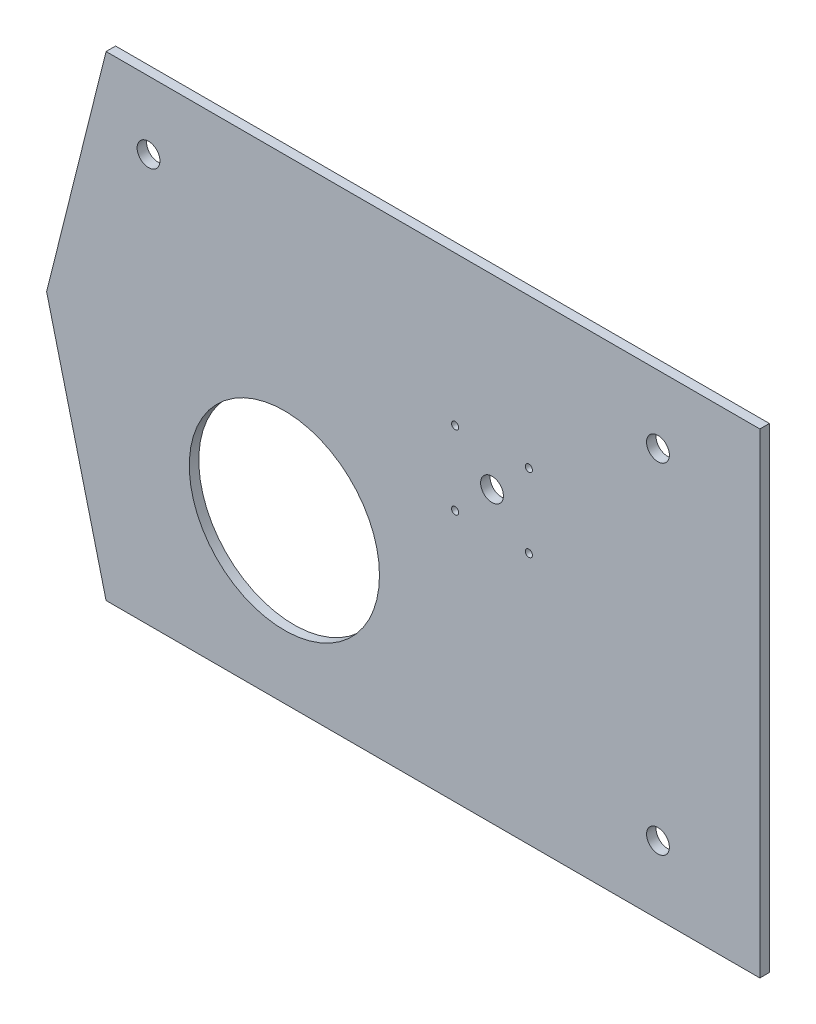
ISO-10303-21;
HEADER;
FILE_DESCRIPTION(('STEP AP214'),'2;1');
FILE_NAME('part.step','',(''),(''),'','','');
FILE_SCHEMA(('AUTOMOTIVE_DESIGN { 1 0 10303 214 1 1 1 1 }'));
ENDSEC;
DATA;
#1=APPLICATION_CONTEXT('core data for automotive mechanical design processes');
#2=APPLICATION_PROTOCOL_DEFINITION('international standard','automotive_design',2000,#1);
#3=PRODUCT_CONTEXT('',#1,'mechanical');
#4=PRODUCT('Part','Part','',(#3));
#5=PRODUCT_RELATED_PRODUCT_CATEGORY('part','',(#4));
#6=PRODUCT_DEFINITION_FORMATION('','',#4);
#7=PRODUCT_DEFINITION_CONTEXT('part definition',#1,'design');
#8=PRODUCT_DEFINITION('design','',#6,#7);
#9=PRODUCT_DEFINITION_SHAPE('','',#8);
#10=(LENGTH_UNIT() NAMED_UNIT(*) SI_UNIT(.MILLI.,.METRE.));
#11=(NAMED_UNIT(*) PLANE_ANGLE_UNIT() SI_UNIT($,.RADIAN.));
#12=(NAMED_UNIT(*) SI_UNIT($,.STERADIAN.) SOLID_ANGLE_UNIT());
#13=UNCERTAINTY_MEASURE_WITH_UNIT(LENGTH_MEASURE(1.E-05),#10,'distance_accuracy_value','');
#14=(GEOMETRIC_REPRESENTATION_CONTEXT(3) GLOBAL_UNCERTAINTY_ASSIGNED_CONTEXT((#13)) GLOBAL_UNIT_ASSIGNED_CONTEXT((#10,
#11,#12)) REPRESENTATION_CONTEXT('',''));
#15=CARTESIAN_POINT('',(0.,0.,0.));
#16=DIRECTION('',(0.,0.,1.));
#17=DIRECTION('',(1.,0.,0.));
#18=AXIS2_PLACEMENT_3D('',#15,#16,#17);
#19=CARTESIAN_POINT('',(-141.176470588235,35.2941176470588,4.));
#20=DIRECTION('',(-0.970142500145332,0.242535625036333,0.));
#21=DIRECTION('',(-0.242535625036333,-0.970142500145332,0.));
#22=AXIS2_PLACEMENT_3D('',#19,#20,#21);
#23=PLANE('',#22);
#24=DIRECTION('',(0.242535625036333,0.970142500145332,0.));
#25=VECTOR('',#24,1.);
#26=CARTESIAN_POINT('',(-141.176470588235,35.2941176470588,0.));
#27=LINE('',#26,#25);
#28=CARTESIAN_POINT('',(-150.,0.,0.));
#29=VERTEX_POINT('',#28);
#30=CARTESIAN_POINT('',(-125.,99.9999999999999,0.));
#31=VERTEX_POINT('',#30);
#32=EDGE_CURVE('E142',#29,#31,#27,.T.);
#33=ORIENTED_EDGE('',*,*,#32,.F.);
#34=DIRECTION('',(0.,0.,-1.));
#35=VECTOR('',#34,1.);
#36=CARTESIAN_POINT('',(-150.,0.,4.));
#37=LINE('',#36,#35);
#38=CARTESIAN_POINT('',(-150.,0.,4.));
#39=VERTEX_POINT('',#38);
#40=EDGE_CURVE('E11',#39,#29,#37,.T.);
#41=ORIENTED_EDGE('',*,*,#40,.F.);
#42=DIRECTION('',(0.242535625036333,0.970142500145332,0.));
#43=VECTOR('',#42,1.);
#44=CARTESIAN_POINT('',(-141.176470588235,35.2941176470588,4.));
#45=LINE('',#44,#43);
#46=CARTESIAN_POINT('',(-125.,99.9999999999999,4.));
#47=VERTEX_POINT('',#46);
#48=EDGE_CURVE('E110',#39,#47,#45,.T.);
#49=ORIENTED_EDGE('',*,*,#48,.T.);
#50=DIRECTION('',(0.,0.,-1.));
#51=VECTOR('',#50,1.);
#52=CARTESIAN_POINT('',(-125.,99.9999999999999,4.));
#53=LINE('',#52,#51);
#54=EDGE_CURVE('E80',#47,#31,#53,.T.);
#55=ORIENTED_EDGE('',*,*,#54,.T.);
#56=EDGE_LOOP('',(#33,#41,#49,#55));
#57=FACE_BOUND('',#56,.T.);
#58=ADVANCED_FACE('F37',(#57),#23,.T.);
#59=CARTESIAN_POINT('',(-141.176470588235,-35.2941176470588,4.));
#60=DIRECTION('',(-0.970142500145332,-0.242535625036333,0.));
#61=DIRECTION('',(0.242535625036333,-0.970142500145332,0.));
#62=AXIS2_PLACEMENT_3D('',#59,#60,#61);
#63=PLANE('',#62);
#64=DIRECTION('',(-0.242535625036333,0.970142500145332,0.));
#65=VECTOR('',#64,1.);
#66=CARTESIAN_POINT('',(-141.176470588235,-35.2941176470588,0.));
#67=LINE('',#66,#65);
#68=CARTESIAN_POINT('',(-125.,-100.,0.));
#69=VERTEX_POINT('',#68);
#70=EDGE_CURVE('E144',#69,#29,#67,.T.);
#71=ORIENTED_EDGE('',*,*,#70,.F.);
#72=DIRECTION('',(0.,0.,-1.));
#73=VECTOR('',#72,1.);
#74=CARTESIAN_POINT('',(-125.,-100.,4.));
#75=LINE('',#74,#73);
#76=CARTESIAN_POINT('',(-125.,-100.,4.));
#77=VERTEX_POINT('',#76);
#78=EDGE_CURVE('E46',#77,#69,#75,.T.);
#79=ORIENTED_EDGE('',*,*,#78,.F.);
#80=DIRECTION('',(-0.242535625036333,0.970142500145332,0.));
#81=VECTOR('',#80,1.);
#82=CARTESIAN_POINT('',(-141.176470588235,-35.2941176470588,4.));
#83=LINE('',#82,#81);
#84=EDGE_CURVE('E108',#77,#39,#83,.T.);
#85=ORIENTED_EDGE('',*,*,#84,.T.);
#86=ORIENTED_EDGE('',*,*,#40,.T.);
#87=EDGE_LOOP('',(#71,#79,#85,#86));
#88=FACE_BOUND('',#87,.T.);
#89=ADVANCED_FACE('F155',(#88),#63,.T.);
#90=CARTESIAN_POINT('',(0.,-100.,4.));
#91=DIRECTION('',(0.,-1.,0.));
#92=DIRECTION('',(1.,0.,0.));
#93=AXIS2_PLACEMENT_3D('',#90,#91,#92);
#94=PLANE('',#93);
#95=DIRECTION('',(-1.,0.,0.));
#96=VECTOR('',#95,1.);
#97=CARTESIAN_POINT('',(0.,-100.,0.));
#98=LINE('',#97,#96);
#99=CARTESIAN_POINT('',(150.,-99.9999999999999,0.));
#100=VERTEX_POINT('',#99);
#101=EDGE_CURVE('E96',#100,#69,#98,.T.);
#102=ORIENTED_EDGE('',*,*,#101,.F.);
#103=DIRECTION('',(0.,0.,-1.));
#104=VECTOR('',#103,1.);
#105=CARTESIAN_POINT('',(150.,-99.9999999999999,4.));
#106=LINE('',#105,#104);
#107=CARTESIAN_POINT('',(150.,-99.9999999999999,4.));
#108=VERTEX_POINT('',#107);
#109=EDGE_CURVE('E90',#108,#100,#106,.T.);
#110=ORIENTED_EDGE('',*,*,#109,.F.);
#111=DIRECTION('',(-1.,0.,0.));
#112=VECTOR('',#111,1.);
#113=CARTESIAN_POINT('',(0.,-100.,4.));
#114=LINE('',#113,#112);
#115=EDGE_CURVE('E94',#108,#77,#114,.T.);
#116=ORIENTED_EDGE('',*,*,#115,.T.);
#117=ORIENTED_EDGE('',*,*,#78,.T.);
#118=EDGE_LOOP('',(#102,#110,#116,#117));
#119=FACE_BOUND('',#118,.T.);
#120=ADVANCED_FACE('F92',(#119),#94,.T.);
#121=CARTESIAN_POINT('',(150.,0.,4.));
#122=DIRECTION('',(-1.,0.,0.));
#123=DIRECTION('',(0.,-1.,0.));
#124=AXIS2_PLACEMENT_3D('',#121,#122,#123);
#125=PLANE('',#124);
#126=DIRECTION('',(0.,1.,0.));
#127=VECTOR('',#126,1.);
#128=CARTESIAN_POINT('',(150.,0.,0.));
#129=LINE('',#128,#127);
#130=CARTESIAN_POINT('',(150.,100.,0.));
#131=VERTEX_POINT('',#130);
#132=EDGE_CURVE('E148',#100,#131,#129,.T.);
#133=ORIENTED_EDGE('',*,*,#132,.T.);
#134=DIRECTION('',(0.,0.,-1.));
#135=VECTOR('',#134,1.);
#136=CARTESIAN_POINT('',(150.,100.,4.));
#137=LINE('',#136,#135);
#138=CARTESIAN_POINT('',(150.,100.,4.));
#139=VERTEX_POINT('',#138);
#140=EDGE_CURVE('E99',#139,#131,#137,.T.);
#141=ORIENTED_EDGE('',*,*,#140,.F.);
#142=DIRECTION('',(0.,1.,0.));
#143=VECTOR('',#142,1.);
#144=CARTESIAN_POINT('',(150.,0.,4.));
#145=LINE('',#144,#143);
#146=EDGE_CURVE('E102',#108,#139,#145,.T.);
#147=ORIENTED_EDGE('',*,*,#146,.F.);
#148=ORIENTED_EDGE('',*,*,#109,.T.);
#149=EDGE_LOOP('',(#133,#141,#147,#148));
#150=FACE_BOUND('',#149,.T.);
#151=ADVANCED_FACE('F103',(#150),#125,.F.);
#152=CARTESIAN_POINT('',(21.832408691632,37.1520265063954,4.));
#153=DIRECTION('',(0.,0.,-1.));
#154=DIRECTION('',(-1.,0.,0.));
#155=AXIS2_PLACEMENT_3D('',#152,#153,#154);
#156=CYLINDRICAL_SURFACE('',#155,1.5);
#157=CARTESIAN_POINT('',(21.832408691632,37.1520265063954,4.));
#158=DIRECTION('',(0.,0.,1.));
#159=DIRECTION('',(1.,0.,0.));
#160=AXIS2_PLACEMENT_3D('',#157,#158,#159);
#161=CIRCLE('',#160,1.5);
#162=CARTESIAN_POINT('',(23.332408691632,37.1520265063954,4.));
#163=VERTEX_POINT('',#162);
#164=EDGE_CURVE('E259',#163,#163,#161,.T.);
#165=ORIENTED_EDGE('',*,*,#164,.T.);
#166=EDGE_LOOP('',(#165));
#167=FACE_BOUND('',#166,.T.);
#168=CARTESIAN_POINT('',(21.832408691632,37.1520265063954,0.));
#169=DIRECTION('',(0.,0.,1.));
#170=DIRECTION('',(1.,0.,0.));
#171=AXIS2_PLACEMENT_3D('',#168,#169,#170);
#172=CIRCLE('',#171,1.5);
#173=CARTESIAN_POINT('',(23.332408691632,37.1520265063954,0.));
#174=VERTEX_POINT('',#173);
#175=EDGE_CURVE('E139',#174,#174,#172,.T.);
#176=ORIENTED_EDGE('',*,*,#175,.F.);
#177=EDGE_LOOP('',(#176));
#178=FACE_BOUND('',#177,.T.);
#179=ADVANCED_FACE('F176',(#167,#178),#156,.F.);
#180=CARTESIAN_POINT('',(52.832408691632,37.1520265063954,4.));
#181=DIRECTION('',(0.,0.,-1.));
#182=DIRECTION('',(-1.,0.,0.));
#183=AXIS2_PLACEMENT_3D('',#180,#181,#182);
#184=CYLINDRICAL_SURFACE('',#183,1.50000000000003);
#185=CARTESIAN_POINT('',(52.832408691632,37.1520265063954,4.));
#186=DIRECTION('',(0.,0.,1.));
#187=DIRECTION('',(1.,0.,0.));
#188=AXIS2_PLACEMENT_3D('',#185,#186,#187);
#189=CIRCLE('',#188,1.50000000000003);
#190=CARTESIAN_POINT('',(54.332408691632,37.1520265063954,4.));
#191=VERTEX_POINT('',#190);
#192=EDGE_CURVE('E256',#191,#191,#189,.T.);
#193=ORIENTED_EDGE('',*,*,#192,.T.);
#194=EDGE_LOOP('',(#193));
#195=FACE_BOUND('',#194,.T.);
#196=CARTESIAN_POINT('',(52.832408691632,37.1520265063954,0.));
#197=DIRECTION('',(0.,0.,1.));
#198=DIRECTION('',(1.,0.,0.));
#199=AXIS2_PLACEMENT_3D('',#196,#197,#198);
#200=CIRCLE('',#199,1.50000000000003);
#201=CARTESIAN_POINT('',(54.332408691632,37.1520265063954,0.));
#202=VERTEX_POINT('',#201);
#203=EDGE_CURVE('E136',#202,#202,#200,.T.);
#204=ORIENTED_EDGE('',*,*,#203,.F.);
#205=EDGE_LOOP('',(#204));
#206=FACE_BOUND('',#205,.T.);
#207=ADVANCED_FACE('F179',(#195,#206),#184,.F.);
#208=CARTESIAN_POINT('',(52.832408691632,6.15202650639541,4.));
#209=DIRECTION('',(0.,0.,-1.));
#210=DIRECTION('',(-1.,0.,0.));
#211=AXIS2_PLACEMENT_3D('',#208,#209,#210);
#212=CYLINDRICAL_SURFACE('',#211,1.50000000000003);
#213=CARTESIAN_POINT('',(52.832408691632,6.15202650639541,4.));
#214=DIRECTION('',(0.,0.,1.));
#215=DIRECTION('',(1.,0.,0.));
#216=AXIS2_PLACEMENT_3D('',#213,#214,#215);
#217=CIRCLE('',#216,1.50000000000003);
#218=CARTESIAN_POINT('',(54.332408691632,6.15202650639541,4.));
#219=VERTEX_POINT('',#218);
#220=EDGE_CURVE('E253',#219,#219,#217,.T.);
#221=ORIENTED_EDGE('',*,*,#220,.T.);
#222=EDGE_LOOP('',(#221));
#223=FACE_BOUND('',#222,.T.);
#224=CARTESIAN_POINT('',(52.832408691632,6.15202650639541,0.));
#225=DIRECTION('',(0.,0.,1.));
#226=DIRECTION('',(1.,0.,0.));
#227=AXIS2_PLACEMENT_3D('',#224,#225,#226);
#228=CIRCLE('',#227,1.50000000000003);
#229=CARTESIAN_POINT('',(54.332408691632,6.15202650639541,0.));
#230=VERTEX_POINT('',#229);
#231=EDGE_CURVE('E133',#230,#230,#228,.T.);
#232=ORIENTED_EDGE('',*,*,#231,.F.);
#233=EDGE_LOOP('',(#232));
#234=FACE_BOUND('',#233,.T.);
#235=ADVANCED_FACE('F183',(#223,#234),#212,.F.);
#236=CARTESIAN_POINT('',(21.832408691632,6.15202650639541,4.));
#237=DIRECTION('',(0.,0.,-1.));
#238=DIRECTION('',(-1.,0.,0.));
#239=AXIS2_PLACEMENT_3D('',#236,#237,#238);
#240=CYLINDRICAL_SURFACE('',#239,1.5);
#241=CARTESIAN_POINT('',(21.832408691632,6.15202650639541,4.));
#242=DIRECTION('',(0.,0.,1.));
#243=DIRECTION('',(1.,0.,0.));
#244=AXIS2_PLACEMENT_3D('',#241,#242,#243);
#245=CIRCLE('',#244,1.5);
#246=CARTESIAN_POINT('',(23.332408691632,6.15202650639541,4.));
#247=VERTEX_POINT('',#246);
#248=EDGE_CURVE('E250',#247,#247,#245,.T.);
#249=ORIENTED_EDGE('',*,*,#248,.T.);
#250=EDGE_LOOP('',(#249));
#251=FACE_BOUND('',#250,.T.);
#252=CARTESIAN_POINT('',(21.832408691632,6.15202650639541,0.));
#253=DIRECTION('',(0.,0.,1.));
#254=DIRECTION('',(1.,0.,0.));
#255=AXIS2_PLACEMENT_3D('',#252,#253,#254);
#256=CIRCLE('',#255,1.5);
#257=CARTESIAN_POINT('',(23.332408691632,6.15202650639541,0.));
#258=VERTEX_POINT('',#257);
#259=EDGE_CURVE('E130',#258,#258,#256,.T.);
#260=ORIENTED_EDGE('',*,*,#259,.F.);
#261=EDGE_LOOP('',(#260));
#262=FACE_BOUND('',#261,.T.);
#263=ADVANCED_FACE('F187',(#251,#262),#240,.F.);
#264=CARTESIAN_POINT('',(107.142857142857,71.4285714285714,4.));
#265=DIRECTION('',(0.,0.,-1.));
#266=DIRECTION('',(-1.,0.,0.));
#267=AXIS2_PLACEMENT_3D('',#264,#265,#266);
#268=CYLINDRICAL_SURFACE('',#267,4.8);
#269=CARTESIAN_POINT('',(107.142857142857,71.4285714285714,4.));
#270=DIRECTION('',(0.,0.,1.));
#271=DIRECTION('',(1.,0.,0.));
#272=AXIS2_PLACEMENT_3D('',#269,#270,#271);
#273=CIRCLE('',#272,4.8);
#274=CARTESIAN_POINT('',(111.942857142857,71.4285714285714,4.));
#275=VERTEX_POINT('',#274);
#276=EDGE_CURVE('E247',#275,#275,#273,.T.);
#277=ORIENTED_EDGE('',*,*,#276,.T.);
#278=EDGE_LOOP('',(#277));
#279=FACE_BOUND('',#278,.T.);
#280=CARTESIAN_POINT('',(107.142857142857,71.4285714285714,0.));
#281=DIRECTION('',(0.,0.,1.));
#282=DIRECTION('',(1.,0.,0.));
#283=AXIS2_PLACEMENT_3D('',#280,#281,#282);
#284=CIRCLE('',#283,4.8);
#285=CARTESIAN_POINT('',(111.942857142857,71.4285714285714,0.));
#286=VERTEX_POINT('',#285);
#287=EDGE_CURVE('E127',#286,#286,#284,.T.);
#288=ORIENTED_EDGE('',*,*,#287,.F.);
#289=EDGE_LOOP('',(#288));
#290=FACE_BOUND('',#289,.T.);
#291=ADVANCED_FACE('F191',(#279,#290),#268,.F.);
#292=CARTESIAN_POINT('',(107.142857142857,-71.4285714285714,4.));
#293=DIRECTION('',(0.,0.,-1.));
#294=DIRECTION('',(-1.,0.,0.));
#295=AXIS2_PLACEMENT_3D('',#292,#293,#294);
#296=CYLINDRICAL_SURFACE('',#295,4.8);
#297=CARTESIAN_POINT('',(107.142857142857,-71.4285714285714,4.));
#298=DIRECTION('',(0.,0.,1.));
#299=DIRECTION('',(1.,0.,0.));
#300=AXIS2_PLACEMENT_3D('',#297,#298,#299);
#301=CIRCLE('',#300,4.8);
#302=CARTESIAN_POINT('',(111.942857142857,-71.4285714285714,4.));
#303=VERTEX_POINT('',#302);
#304=EDGE_CURVE('E240',#303,#303,#301,.T.);
#305=ORIENTED_EDGE('',*,*,#304,.T.);
#306=EDGE_LOOP('',(#305));
#307=FACE_BOUND('',#306,.T.);
#308=CARTESIAN_POINT('',(107.142857142857,-71.4285714285714,0.));
#309=DIRECTION('',(0.,0.,1.));
#310=DIRECTION('',(1.,0.,0.));
#311=AXIS2_PLACEMENT_3D('',#308,#309,#310);
#312=CIRCLE('',#311,4.8);
#313=CARTESIAN_POINT('',(111.942857142857,-71.4285714285714,0.));
#314=VERTEX_POINT('',#313);
#315=EDGE_CURVE('E124',#314,#314,#312,.T.);
#316=ORIENTED_EDGE('',*,*,#315,.F.);
#317=EDGE_LOOP('',(#316));
#318=FACE_BOUND('',#317,.T.);
#319=ADVANCED_FACE('F195',(#307,#318),#296,.F.);
#320=CARTESIAN_POINT('',(37.332408691632,21.6520265063954,4.));
#321=DIRECTION('',(0.,0.,-1.));
#322=DIRECTION('',(-1.,0.,0.));
#323=AXIS2_PLACEMENT_3D('',#320,#321,#322);
#324=CYLINDRICAL_SURFACE('',#323,4.8);
#325=CARTESIAN_POINT('',(37.332408691632,21.6520265063954,4.));
#326=DIRECTION('',(0.,0.,1.));
#327=DIRECTION('',(1.,0.,0.));
#328=AXIS2_PLACEMENT_3D('',#325,#326,#327);
#329=CIRCLE('',#328,4.8);
#330=CARTESIAN_POINT('',(42.132408691632,21.6520265063954,4.));
#331=VERTEX_POINT('',#330);
#332=EDGE_CURVE('E237',#331,#331,#329,.T.);
#333=ORIENTED_EDGE('',*,*,#332,.T.);
#334=EDGE_LOOP('',(#333));
#335=FACE_BOUND('',#334,.T.);
#336=CARTESIAN_POINT('',(37.332408691632,21.6520265063954,0.));
#337=DIRECTION('',(0.,0.,1.));
#338=DIRECTION('',(1.,0.,0.));
#339=AXIS2_PLACEMENT_3D('',#336,#337,#338);
#340=CIRCLE('',#339,4.8);
#341=CARTESIAN_POINT('',(42.132408691632,21.6520265063954,0.));
#342=VERTEX_POINT('',#341);
#343=EDGE_CURVE('E121',#342,#342,#340,.T.);
#344=ORIENTED_EDGE('',*,*,#343,.F.);
#345=EDGE_LOOP('',(#344));
#346=FACE_BOUND('',#345,.T.);
#347=ADVANCED_FACE('F199',(#335,#346),#324,.F.);
#348=CARTESIAN_POINT('',(-50.,-33.3333333333334,4.));
#349=DIRECTION('',(0.,0.,-1.));
#350=DIRECTION('',(-1.,0.,0.));
#351=AXIS2_PLACEMENT_3D('',#348,#349,#350);
#352=CYLINDRICAL_SURFACE('',#351,40.);
#353=CARTESIAN_POINT('',(-50.,-33.3333333333334,4.));
#354=DIRECTION('',(0.,0.,1.));
#355=DIRECTION('',(1.,0.,0.));
#356=AXIS2_PLACEMENT_3D('',#353,#354,#355);
#357=CIRCLE('',#356,40.);
#358=CARTESIAN_POINT('',(-9.99999999999997,-33.3333333333334,4.));
#359=VERTEX_POINT('',#358);
#360=EDGE_CURVE('E213',#359,#359,#357,.T.);
#361=ORIENTED_EDGE('',*,*,#360,.T.);
#362=EDGE_LOOP('',(#361));
#363=FACE_BOUND('',#362,.T.);
#364=CARTESIAN_POINT('',(-50.,-33.3333333333334,0.));
#365=DIRECTION('',(0.,0.,1.));
#366=DIRECTION('',(1.,0.,0.));
#367=AXIS2_PLACEMENT_3D('',#364,#365,#366);
#368=CIRCLE('',#367,40.);
#369=CARTESIAN_POINT('',(-9.99999999999997,-33.3333333333334,0.));
#370=VERTEX_POINT('',#369);
#371=EDGE_CURVE('E118',#370,#370,#368,.T.);
#372=ORIENTED_EDGE('',*,*,#371,.F.);
#373=EDGE_LOOP('',(#372));
#374=FACE_BOUND('',#373,.T.);
#375=ADVANCED_FACE('F202',(#363,#374),#352,.F.);
#376=CARTESIAN_POINT('',(-107.142857142857,71.4285714285713,4.));
#377=DIRECTION('',(0.,0.,-1.));
#378=DIRECTION('',(-1.,0.,0.));
#379=AXIS2_PLACEMENT_3D('',#376,#377,#378);
#380=CYLINDRICAL_SURFACE('',#379,4.8);
#381=CARTESIAN_POINT('',(-107.142857142857,71.4285714285713,4.));
#382=DIRECTION('',(0.,0.,1.));
#383=DIRECTION('',(1.,0.,0.));
#384=AXIS2_PLACEMENT_3D('',#381,#382,#383);
#385=CIRCLE('',#384,4.8);
#386=CARTESIAN_POINT('',(-102.342857142857,71.4285714285713,4.));
#387=VERTEX_POINT('',#386);
#388=EDGE_CURVE('E151',#387,#387,#385,.T.);
#389=ORIENTED_EDGE('',*,*,#388,.T.);
#390=EDGE_LOOP('',(#389));
#391=FACE_BOUND('',#390,.T.);
#392=CARTESIAN_POINT('',(-107.142857142857,71.4285714285713,0.));
#393=DIRECTION('',(0.,0.,1.));
#394=DIRECTION('',(1.,0.,0.));
#395=AXIS2_PLACEMENT_3D('',#392,#393,#394);
#396=CIRCLE('',#395,4.8);
#397=CARTESIAN_POINT('',(-102.342857142857,71.4285714285713,0.));
#398=VERTEX_POINT('',#397);
#399=EDGE_CURVE('E115',#398,#398,#396,.T.);
#400=ORIENTED_EDGE('',*,*,#399,.F.);
#401=EDGE_LOOP('',(#400));
#402=FACE_BOUND('',#401,.T.);
#403=ADVANCED_FACE('F39',(#391,#402),#380,.F.);
#404=CARTESIAN_POINT('',(0.,100.,4.));
#405=DIRECTION('',(0.,-1.,0.));
#406=DIRECTION('',(1.,0.,0.));
#407=AXIS2_PLACEMENT_3D('',#404,#405,#406);
#408=PLANE('',#407);
#409=DIRECTION('',(-1.,0.,0.));
#410=VECTOR('',#409,1.);
#411=CARTESIAN_POINT('',(0.,100.,0.));
#412=LINE('',#411,#410);
#413=EDGE_CURVE('E73',#131,#31,#412,.T.);
#414=ORIENTED_EDGE('',*,*,#413,.T.);
#415=ORIENTED_EDGE('',*,*,#54,.F.);
#416=DIRECTION('',(-1.,0.,0.));
#417=VECTOR('',#416,1.);
#418=CARTESIAN_POINT('',(0.,100.,4.));
#419=LINE('',#418,#417);
#420=EDGE_CURVE('E54',#139,#47,#419,.T.);
#421=ORIENTED_EDGE('',*,*,#420,.F.);
#422=ORIENTED_EDGE('',*,*,#140,.T.);
#423=EDGE_LOOP('',(#414,#415,#421,#422));
#424=FACE_BOUND('',#423,.T.);
#425=ADVANCED_FACE('F163',(#424),#408,.F.);
#426=CARTESIAN_POINT('',(0.,0.,4.));
#427=DIRECTION('',(0.,0.,1.));
#428=DIRECTION('',(1.,0.,0.));
#429=AXIS2_PLACEMENT_3D('',#426,#427,#428);
#430=PLANE('',#429);
#431=ORIENTED_EDGE('',*,*,#388,.F.);
#432=EDGE_LOOP('',(#431));
#433=FACE_BOUND('',#432,.T.);
#434=ORIENTED_EDGE('',*,*,#360,.F.);
#435=EDGE_LOOP('',(#434));
#436=FACE_BOUND('',#435,.T.);
#437=ORIENTED_EDGE('',*,*,#332,.F.);
#438=EDGE_LOOP('',(#437));
#439=FACE_BOUND('',#438,.T.);
#440=ORIENTED_EDGE('',*,*,#304,.F.);
#441=EDGE_LOOP('',(#440));
#442=FACE_BOUND('',#441,.T.);
#443=ORIENTED_EDGE('',*,*,#276,.F.);
#444=EDGE_LOOP('',(#443));
#445=FACE_BOUND('',#444,.T.);
#446=ORIENTED_EDGE('',*,*,#248,.F.);
#447=EDGE_LOOP('',(#446));
#448=FACE_BOUND('',#447,.T.);
#449=ORIENTED_EDGE('',*,*,#220,.F.);
#450=EDGE_LOOP('',(#449));
#451=FACE_BOUND('',#450,.T.);
#452=ORIENTED_EDGE('',*,*,#192,.F.);
#453=EDGE_LOOP('',(#452));
#454=FACE_BOUND('',#453,.T.);
#455=ORIENTED_EDGE('',*,*,#164,.F.);
#456=EDGE_LOOP('',(#455));
#457=FACE_BOUND('',#456,.T.);
#458=ORIENTED_EDGE('',*,*,#48,.F.);
#459=ORIENTED_EDGE('',*,*,#84,.F.);
#460=ORIENTED_EDGE('',*,*,#115,.F.);
#461=ORIENTED_EDGE('',*,*,#146,.T.);
#462=ORIENTED_EDGE('',*,*,#420,.T.);
#463=EDGE_LOOP('',(#458,#459,#460,#461,#462));
#464=FACE_BOUND('',#463,.T.);
#465=ADVANCED_FACE('F106',(#433,#436,#439,#442,#445,#448,#451,#454,#457,#464),#430,.T.);
#466=CARTESIAN_POINT('',(0.,0.,0.));
#467=DIRECTION('',(0.,0.,1.));
#468=DIRECTION('',(1.,0.,0.));
#469=AXIS2_PLACEMENT_3D('',#466,#467,#468);
#470=PLANE('',#469);
#471=ORIENTED_EDGE('',*,*,#399,.T.);
#472=EDGE_LOOP('',(#471));
#473=FACE_BOUND('',#472,.T.);
#474=ORIENTED_EDGE('',*,*,#371,.T.);
#475=EDGE_LOOP('',(#474));
#476=FACE_BOUND('',#475,.T.);
#477=ORIENTED_EDGE('',*,*,#343,.T.);
#478=EDGE_LOOP('',(#477));
#479=FACE_BOUND('',#478,.T.);
#480=ORIENTED_EDGE('',*,*,#315,.T.);
#481=EDGE_LOOP('',(#480));
#482=FACE_BOUND('',#481,.T.);
#483=ORIENTED_EDGE('',*,*,#287,.T.);
#484=EDGE_LOOP('',(#483));
#485=FACE_BOUND('',#484,.T.);
#486=ORIENTED_EDGE('',*,*,#259,.T.);
#487=EDGE_LOOP('',(#486));
#488=FACE_BOUND('',#487,.T.);
#489=ORIENTED_EDGE('',*,*,#231,.T.);
#490=EDGE_LOOP('',(#489));
#491=FACE_BOUND('',#490,.T.);
#492=ORIENTED_EDGE('',*,*,#203,.T.);
#493=EDGE_LOOP('',(#492));
#494=FACE_BOUND('',#493,.T.);
#495=ORIENTED_EDGE('',*,*,#175,.T.);
#496=EDGE_LOOP('',(#495));
#497=FACE_BOUND('',#496,.T.);
#498=ORIENTED_EDGE('',*,*,#32,.T.);
#499=ORIENTED_EDGE('',*,*,#413,.F.);
#500=ORIENTED_EDGE('',*,*,#132,.F.);
#501=ORIENTED_EDGE('',*,*,#101,.T.);
#502=ORIENTED_EDGE('',*,*,#70,.T.);
#503=EDGE_LOOP('',(#498,#499,#500,#501,#502));
#504=FACE_BOUND('',#503,.T.);
#505=ADVANCED_FACE('F156',(#473,#476,#479,#482,#485,#488,#491,#494,#497,#504),#470,.F.);
#506=CLOSED_SHELL('',(#58,#89,#120,#151,#179,#207,#235,#263,#291,#319,#347,#375,#403,#425,#465,#505));
#507=MANIFOLD_SOLID_BREP('B2',#506);
#508=ADVANCED_BREP_SHAPE_REPRESENTATION('',(#18,#507),#14);
#509=SHAPE_DEFINITION_REPRESENTATION(#9,#508);
ENDSEC;
END-ISO-10303-21;
